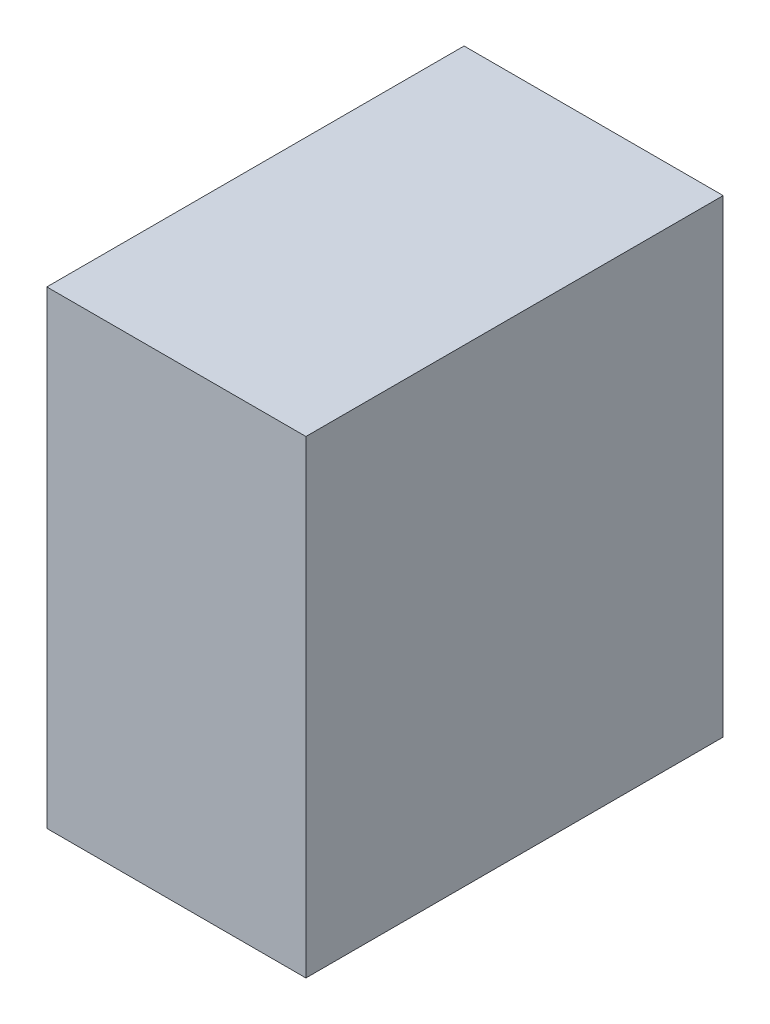
ISO-10303-21;
HEADER;
FILE_DESCRIPTION(('STEP AP214'),'2;1');
FILE_NAME('part.step','',(''),(''),'','','');
FILE_SCHEMA(('AUTOMOTIVE_DESIGN { 1 0 10303 214 1 1 1 1 }'));
ENDSEC;
DATA;
#1=APPLICATION_CONTEXT('core data for automotive mechanical design processes');
#2=APPLICATION_PROTOCOL_DEFINITION('international standard','automotive_design',2000,#1);
#3=PRODUCT_CONTEXT('',#1,'mechanical');
#4=PRODUCT('Part','Part','',(#3));
#5=PRODUCT_RELATED_PRODUCT_CATEGORY('part','',(#4));
#6=PRODUCT_DEFINITION_FORMATION('','',#4);
#7=PRODUCT_DEFINITION_CONTEXT('part definition',#1,'design');
#8=PRODUCT_DEFINITION('design','',#6,#7);
#9=PRODUCT_DEFINITION_SHAPE('','',#8);
#10=(LENGTH_UNIT() NAMED_UNIT(*) SI_UNIT(.MILLI.,.METRE.));
#11=(NAMED_UNIT(*) PLANE_ANGLE_UNIT() SI_UNIT($,.RADIAN.));
#12=(NAMED_UNIT(*) SI_UNIT($,.STERADIAN.) SOLID_ANGLE_UNIT());
#13=UNCERTAINTY_MEASURE_WITH_UNIT(LENGTH_MEASURE(1.E-05),#10,'distance_accuracy_value','');
#14=(GEOMETRIC_REPRESENTATION_CONTEXT(3) GLOBAL_UNCERTAINTY_ASSIGNED_CONTEXT((#13)) GLOBAL_UNIT_ASSIGNED_CONTEXT((#10,
#11,#12)) REPRESENTATION_CONTEXT('',''));
#15=CARTESIAN_POINT('',(0.,0.,0.));
#16=DIRECTION('',(0.,0.,1.));
#17=DIRECTION('',(1.,0.,0.));
#18=AXIS2_PLACEMENT_3D('',#15,#16,#17);
#19=CARTESIAN_POINT('',(85.2,0.,0.));
#20=DIRECTION('',(0.,0.,1.));
#21=DIRECTION('',(1.,0.,0.));
#22=AXIS2_PLACEMENT_3D('',#19,#20,#21);
#23=PLANE('',#22);
#24=DIRECTION('',(0.,-1.,0.));
#25=VECTOR('',#24,1.);
#26=CARTESIAN_POINT('',(1.5,153.,0.));
#27=LINE('',#26,#25);
#28=CARTESIAN_POINT('',(1.5,153.,0.));
#29=VERTEX_POINT('',#28);
#30=CARTESIAN_POINT('',(1.5,151.5,0.));
#31=VERTEX_POINT('',#30);
#32=EDGE_CURVE('E104',#29,#31,#27,.T.);
#33=ORIENTED_EDGE('',*,*,#32,.F.);
#34=DIRECTION('',(-1.,0.,0.));
#35=VECTOR('',#34,1.);
#36=CARTESIAN_POINT('',(85.2,153.,0.));
#37=LINE('',#36,#35);
#38=CARTESIAN_POINT('',(85.2,153.,0.));
#39=VERTEX_POINT('',#38);
#40=EDGE_CURVE('E50',#39,#29,#37,.T.);
#41=ORIENTED_EDGE('',*,*,#40,.F.);
#42=DIRECTION('',(0.,1.,0.));
#43=VECTOR('',#42,1.);
#44=CARTESIAN_POINT('',(85.2,0.,0.));
#45=LINE('',#44,#43);
#46=CARTESIAN_POINT('',(85.2,1.5,0.));
#47=VERTEX_POINT('',#46);
#48=EDGE_CURVE('E62',#47,#39,#45,.T.);
#49=ORIENTED_EDGE('',*,*,#48,.F.);
#50=DIRECTION('',(1.,0.,0.));
#51=VECTOR('',#50,1.);
#52=CARTESIAN_POINT('',(0.,1.5,0.));
#53=LINE('',#52,#51);
#54=CARTESIAN_POINT('',(83.7,1.5,0.));
#55=VERTEX_POINT('',#54);
#56=EDGE_CURVE('E150',#55,#47,#53,.T.);
#57=ORIENTED_EDGE('',*,*,#56,.F.);
#58=DIRECTION('',(0.,1.,0.));
#59=VECTOR('',#58,1.);
#60=CARTESIAN_POINT('',(83.7,0.,0.));
#61=LINE('',#60,#59);
#62=CARTESIAN_POINT('',(83.7,151.5,0.));
#63=VERTEX_POINT('',#62);
#64=EDGE_CURVE('E125',#55,#63,#61,.T.);
#65=ORIENTED_EDGE('',*,*,#64,.T.);
#66=DIRECTION('',(-1.,0.,0.));
#67=VECTOR('',#66,1.);
#68=CARTESIAN_POINT('',(85.2,151.5,0.));
#69=LINE('',#68,#67);
#70=EDGE_CURVE('E115',#63,#31,#69,.T.);
#71=ORIENTED_EDGE('',*,*,#70,.T.);
#72=EDGE_LOOP('',(#33,#41,#49,#57,#65,#71));
#73=FACE_BOUND('',#72,.T.);
#74=ADVANCED_FACE('F43',(#73),#23,.F.);
#75=CARTESIAN_POINT('',(85.2,0.,134.8));
#76=DIRECTION('',(0.,0.,-1.));
#77=DIRECTION('',(-1.,0.,0.));
#78=AXIS2_PLACEMENT_3D('',#75,#76,#77);
#79=PLANE('',#78);
#80=DIRECTION('',(0.,1.,0.));
#81=VECTOR('',#80,1.);
#82=CARTESIAN_POINT('',(1.5,153.,134.8));
#83=LINE('',#82,#81);
#84=CARTESIAN_POINT('',(1.5,1.5,134.8));
#85=VERTEX_POINT('',#84);
#86=CARTESIAN_POINT('',(1.5,153.,134.8));
#87=VERTEX_POINT('',#86);
#88=EDGE_CURVE('E107',#85,#87,#83,.T.);
#89=ORIENTED_EDGE('',*,*,#88,.F.);
#90=DIRECTION('',(-1.,0.,0.));
#91=VECTOR('',#90,1.);
#92=CARTESIAN_POINT('',(0.,1.5,134.8));
#93=LINE('',#92,#91);
#94=CARTESIAN_POINT('',(85.2,1.5,134.8));
#95=VERTEX_POINT('',#94);
#96=EDGE_CURVE('E136',#95,#85,#93,.T.);
#97=ORIENTED_EDGE('',*,*,#96,.F.);
#98=DIRECTION('',(0.,-1.,0.));
#99=VECTOR('',#98,1.);
#100=CARTESIAN_POINT('',(85.2,0.,134.8));
#101=LINE('',#100,#99);
#102=CARTESIAN_POINT('',(85.2,153.,134.8));
#103=VERTEX_POINT('',#102);
#104=EDGE_CURVE('E119',#103,#95,#101,.T.);
#105=ORIENTED_EDGE('',*,*,#104,.F.);
#106=DIRECTION('',(-1.,0.,0.));
#107=VECTOR('',#106,1.);
#108=CARTESIAN_POINT('',(85.2,153.,134.8));
#109=LINE('',#108,#107);
#110=EDGE_CURVE('E118',#103,#87,#109,.T.);
#111=ORIENTED_EDGE('',*,*,#110,.T.);
#112=EDGE_LOOP('',(#89,#97,#105,#111));
#113=FACE_BOUND('',#112,.T.);
#114=ADVANCED_FACE('F161',(#113),#79,.F.);
#115=CARTESIAN_POINT('',(85.2,153.,0.));
#116=DIRECTION('',(0.,-1.,0.));
#117=DIRECTION('',(0.,0.,-1.));
#118=AXIS2_PLACEMENT_3D('',#115,#116,#117);
#119=PLANE('',#118);
#120=DIRECTION('',(0.,0.,-1.));
#121=VECTOR('',#120,1.);
#122=CARTESIAN_POINT('',(1.5,153.,134.8));
#123=LINE('',#122,#121);
#124=EDGE_CURVE('E101',#87,#29,#123,.T.);
#125=ORIENTED_EDGE('',*,*,#124,.F.);
#126=ORIENTED_EDGE('',*,*,#110,.F.);
#127=DIRECTION('',(0.,0.,1.));
#128=VECTOR('',#127,1.);
#129=CARTESIAN_POINT('',(85.2,153.,0.));
#130=LINE('',#129,#128);
#131=EDGE_CURVE('E57',#39,#103,#130,.T.);
#132=ORIENTED_EDGE('',*,*,#131,.F.);
#133=ORIENTED_EDGE('',*,*,#40,.T.);
#134=EDGE_LOOP('',(#125,#126,#132,#133));
#135=FACE_BOUND('',#134,.T.);
#136=ADVANCED_FACE('F117',(#135),#119,.F.);
#137=CARTESIAN_POINT('',(0.,1.5,0.));
#138=DIRECTION('',(0.,-1.,0.));
#139=DIRECTION('',(0.,0.,-1.));
#140=AXIS2_PLACEMENT_3D('',#137,#138,#139);
#141=PLANE('',#140);
#142=ORIENTED_EDGE('',*,*,#96,.T.);
#143=DIRECTION('',(0.,0.,-1.));
#144=VECTOR('',#143,1.);
#145=CARTESIAN_POINT('',(1.5,1.5,0.));
#146=LINE('',#145,#144);
#147=CARTESIAN_POINT('',(1.5,1.5,133.3));
#148=VERTEX_POINT('',#147);
#149=EDGE_CURVE('E11',#85,#148,#146,.T.);
#150=ORIENTED_EDGE('',*,*,#149,.T.);
#151=DIRECTION('',(-1.,0.,0.));
#152=VECTOR('',#151,1.);
#153=CARTESIAN_POINT('',(85.2,1.5,133.3));
#154=LINE('',#153,#152);
#155=CARTESIAN_POINT('',(83.7,1.5,133.3));
#156=VERTEX_POINT('',#155);
#157=EDGE_CURVE('E139',#156,#148,#154,.T.);
#158=ORIENTED_EDGE('',*,*,#157,.F.);
#159=DIRECTION('',(0.,0.,-1.));
#160=VECTOR('',#159,1.);
#161=CARTESIAN_POINT('',(83.7,1.5,0.));
#162=LINE('',#161,#160);
#163=EDGE_CURVE('E128',#156,#55,#162,.T.);
#164=ORIENTED_EDGE('',*,*,#163,.T.);
#165=ORIENTED_EDGE('',*,*,#56,.T.);
#166=DIRECTION('',(0.,0.,1.));
#167=VECTOR('',#166,1.);
#168=CARTESIAN_POINT('',(85.2,1.5,134.8));
#169=LINE('',#168,#167);
#170=EDGE_CURVE('E148',#47,#95,#169,.T.);
#171=ORIENTED_EDGE('',*,*,#170,.T.);
#172=EDGE_LOOP('',(#142,#150,#158,#164,#165,#171));
#173=FACE_BOUND('',#172,.T.);
#174=ADVANCED_FACE('F154',(#173),#141,.T.);
#175=CARTESIAN_POINT('',(85.2,0.,0.));
#176=DIRECTION('',(-1.,0.,0.));
#177=DIRECTION('',(0.,0.,1.));
#178=AXIS2_PLACEMENT_3D('',#175,#176,#177);
#179=PLANE('',#178);
#180=ORIENTED_EDGE('',*,*,#170,.F.);
#181=ORIENTED_EDGE('',*,*,#48,.T.);
#182=ORIENTED_EDGE('',*,*,#131,.T.);
#183=ORIENTED_EDGE('',*,*,#104,.T.);
#184=EDGE_LOOP('',(#180,#181,#182,#183));
#185=FACE_BOUND('',#184,.T.);
#186=ADVANCED_FACE('F158',(#185),#179,.F.);
#187=CARTESIAN_POINT('',(85.2,151.5,0.));
#188=DIRECTION('',(0.,-1.,0.));
#189=DIRECTION('',(0.,0.,-1.));
#190=AXIS2_PLACEMENT_3D('',#187,#188,#189);
#191=PLANE('',#190);
#192=DIRECTION('',(0.,0.,1.));
#193=VECTOR('',#192,1.);
#194=CARTESIAN_POINT('',(1.5,151.5,0.));
#195=LINE('',#194,#193);
#196=CARTESIAN_POINT('',(1.5,151.5,133.3));
#197=VERTEX_POINT('',#196);
#198=EDGE_CURVE('E133',#31,#197,#195,.T.);
#199=ORIENTED_EDGE('',*,*,#198,.F.);
#200=ORIENTED_EDGE('',*,*,#70,.F.);
#201=DIRECTION('',(0.,0.,1.));
#202=VECTOR('',#201,1.);
#203=CARTESIAN_POINT('',(83.7,151.5,0.));
#204=LINE('',#203,#202);
#205=CARTESIAN_POINT('',(83.7,151.5,133.3));
#206=VERTEX_POINT('',#205);
#207=EDGE_CURVE('E127',#63,#206,#204,.T.);
#208=ORIENTED_EDGE('',*,*,#207,.T.);
#209=DIRECTION('',(-1.,0.,0.));
#210=VECTOR('',#209,1.);
#211=CARTESIAN_POINT('',(85.2,151.5,133.3));
#212=LINE('',#211,#210);
#213=EDGE_CURVE('E130',#206,#197,#212,.T.);
#214=ORIENTED_EDGE('',*,*,#213,.T.);
#215=EDGE_LOOP('',(#199,#200,#208,#214));
#216=FACE_BOUND('',#215,.T.);
#217=ADVANCED_FACE('F171',(#216),#191,.T.);
#218=CARTESIAN_POINT('',(85.2,0.,133.3));
#219=DIRECTION('',(0.,0.,-1.));
#220=DIRECTION('',(-1.,0.,0.));
#221=AXIS2_PLACEMENT_3D('',#218,#219,#220);
#222=PLANE('',#221);
#223=DIRECTION('',(0.,-1.,0.));
#224=VECTOR('',#223,1.);
#225=CARTESIAN_POINT('',(1.5,0.,133.3));
#226=LINE('',#225,#224);
#227=EDGE_CURVE('E135',#197,#148,#226,.T.);
#228=ORIENTED_EDGE('',*,*,#227,.F.);
#229=ORIENTED_EDGE('',*,*,#213,.F.);
#230=DIRECTION('',(0.,-1.,0.));
#231=VECTOR('',#230,1.);
#232=CARTESIAN_POINT('',(83.7,0.,133.3));
#233=LINE('',#232,#231);
#234=EDGE_CURVE('E132',#206,#156,#233,.T.);
#235=ORIENTED_EDGE('',*,*,#234,.T.);
#236=ORIENTED_EDGE('',*,*,#157,.T.);
#237=EDGE_LOOP('',(#228,#229,#235,#236));
#238=FACE_BOUND('',#237,.T.);
#239=ADVANCED_FACE('F164',(#238),#222,.T.);
#240=CARTESIAN_POINT('',(83.7,0.,0.));
#241=DIRECTION('',(-1.,0.,0.));
#242=DIRECTION('',(0.,0.,1.));
#243=AXIS2_PLACEMENT_3D('',#240,#241,#242);
#244=PLANE('',#243);
#245=ORIENTED_EDGE('',*,*,#163,.F.);
#246=ORIENTED_EDGE('',*,*,#234,.F.);
#247=ORIENTED_EDGE('',*,*,#207,.F.);
#248=ORIENTED_EDGE('',*,*,#64,.F.);
#249=EDGE_LOOP('',(#245,#246,#247,#248));
#250=FACE_BOUND('',#249,.T.);
#251=ADVANCED_FACE('F169',(#250),#244,.T.);
#252=CARTESIAN_POINT('',(1.5,0.,0.));
#253=DIRECTION('',(-1.,0.,0.));
#254=DIRECTION('',(0.,0.,1.));
#255=AXIS2_PLACEMENT_3D('',#252,#253,#254);
#256=PLANE('',#255);
#257=ORIENTED_EDGE('',*,*,#227,.T.);
#258=ORIENTED_EDGE('',*,*,#149,.F.);
#259=ORIENTED_EDGE('',*,*,#88,.T.);
#260=ORIENTED_EDGE('',*,*,#124,.T.);
#261=ORIENTED_EDGE('',*,*,#32,.T.);
#262=ORIENTED_EDGE('',*,*,#198,.T.);
#263=EDGE_LOOP('',(#257,#258,#259,#260,#261,#262));
#264=FACE_BOUND('',#263,.T.);
#265=ADVANCED_FACE('F103',(#264),#256,.T.);
#266=CLOSED_SHELL('',(#74,#114,#136,#174,#186,#217,#239,#251,#265));
#267=MANIFOLD_SOLID_BREP('B2',#266);
#268=ADVANCED_BREP_SHAPE_REPRESENTATION('',(#18,#267),#14);
#269=SHAPE_DEFINITION_REPRESENTATION(#9,#268);
ENDSEC;
END-ISO-10303-21;
